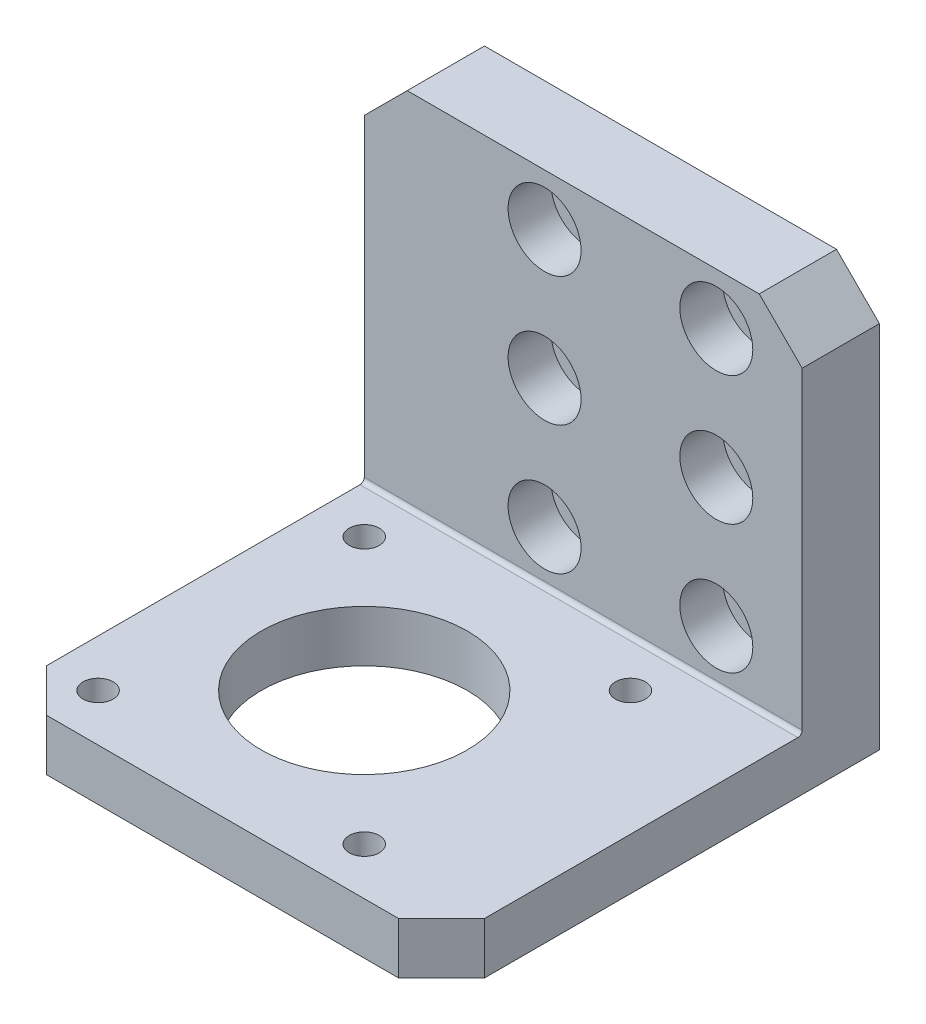
ISO-10303-21;
HEADER;
FILE_DESCRIPTION(('STEP AP214'),'2;1');
FILE_NAME('part.step','',(''),(''),'','','');
FILE_SCHEMA(('AUTOMOTIVE_DESIGN { 1 0 10303 214 1 1 1 1 }'));
ENDSEC;
DATA;
#1=APPLICATION_CONTEXT('core data for automotive mechanical design processes');
#2=APPLICATION_PROTOCOL_DEFINITION('international standard','automotive_design',2000,#1);
#3=PRODUCT_CONTEXT('',#1,'mechanical');
#4=PRODUCT('Part','Part','',(#3));
#5=PRODUCT_RELATED_PRODUCT_CATEGORY('part','',(#4));
#6=PRODUCT_DEFINITION_FORMATION('','',#4);
#7=PRODUCT_DEFINITION_CONTEXT('part definition',#1,'design');
#8=PRODUCT_DEFINITION('design','',#6,#7);
#9=PRODUCT_DEFINITION_SHAPE('','',#8);
#10=(LENGTH_UNIT() NAMED_UNIT(*) SI_UNIT(.MILLI.,.METRE.));
#11=(NAMED_UNIT(*) PLANE_ANGLE_UNIT() SI_UNIT($,.RADIAN.));
#12=(NAMED_UNIT(*) SI_UNIT($,.STERADIAN.) SOLID_ANGLE_UNIT());
#13=UNCERTAINTY_MEASURE_WITH_UNIT(LENGTH_MEASURE(1.E-05),#10,'distance_accuracy_value','');
#14=(GEOMETRIC_REPRESENTATION_CONTEXT(3) GLOBAL_UNCERTAINTY_ASSIGNED_CONTEXT((#13)) GLOBAL_UNIT_ASSIGNED_CONTEXT((#10,
#11,#12)) REPRESENTATION_CONTEXT('',''));
#15=CARTESIAN_POINT('',(0.,0.,0.));
#16=DIRECTION('',(0.,0.,1.));
#17=DIRECTION('',(1.,0.,0.));
#18=AXIS2_PLACEMENT_3D('',#15,#16,#17);
#19=CARTESIAN_POINT('',(20.,15.,9.));
#20=DIRECTION('',(0.,0.,-1.));
#21=DIRECTION('',(-1.,0.,0.));
#22=AXIS2_PLACEMENT_3D('',#19,#20,#21);
#23=CYLINDRICAL_SURFACE('',#22,2.75);
#24=CARTESIAN_POINT('',(20.,15.,0.));
#25=DIRECTION('',(0.,0.,1.));
#26=DIRECTION('',(1.,0.,0.));
#27=AXIS2_PLACEMENT_3D('',#24,#25,#26);
#28=CIRCLE('',#27,2.75);
#29=CARTESIAN_POINT('',(22.75,15.,0.));
#30=VERTEX_POINT('',#29);
#31=EDGE_CURVE('E261',#30,#30,#28,.T.);
#32=ORIENTED_EDGE('',*,*,#31,.F.);
#33=EDGE_LOOP('',(#32));
#34=FACE_BOUND('',#33,.T.);
#35=CARTESIAN_POINT('',(20.,15.,4.));
#36=DIRECTION('',(0.,0.,1.));
#37=DIRECTION('',(1.,0.,0.));
#38=AXIS2_PLACEMENT_3D('',#35,#36,#37);
#39=CIRCLE('',#38,2.75);
#40=CARTESIAN_POINT('',(22.75,15.,4.));
#41=VERTEX_POINT('',#40);
#42=EDGE_CURVE('E187',#41,#41,#39,.T.);
#43=ORIENTED_EDGE('',*,*,#42,.T.);
#44=EDGE_LOOP('',(#43));
#45=FACE_BOUND('',#44,.T.);
#46=ADVANCED_FACE('F33',(#34,#45),#23,.F.);
#47=CARTESIAN_POINT('',(20.0000000000002,0.,9.));
#48=DIRECTION('',(0.,0.,-1.));
#49=DIRECTION('',(-1.,0.,0.));
#50=AXIS2_PLACEMENT_3D('',#47,#48,#49);
#51=CYLINDRICAL_SURFACE('',#50,2.75);
#52=CARTESIAN_POINT('',(20.0000000000002,0.,0.));
#53=DIRECTION('',(0.,0.,1.));
#54=DIRECTION('',(1.,0.,0.));
#55=AXIS2_PLACEMENT_3D('',#52,#53,#54);
#56=CIRCLE('',#55,2.75);
#57=CARTESIAN_POINT('',(22.7500000000002,0.,0.));
#58=VERTEX_POINT('',#57);
#59=EDGE_CURVE('E258',#58,#58,#56,.T.);
#60=ORIENTED_EDGE('',*,*,#59,.F.);
#61=EDGE_LOOP('',(#60));
#62=FACE_BOUND('',#61,.T.);
#63=CARTESIAN_POINT('',(20.0000000000002,0.,4.));
#64=DIRECTION('',(0.,0.,1.));
#65=DIRECTION('',(1.,0.,0.));
#66=AXIS2_PLACEMENT_3D('',#63,#64,#65);
#67=CIRCLE('',#66,2.75);
#68=CARTESIAN_POINT('',(22.7500000000002,0.,4.));
#69=VERTEX_POINT('',#68);
#70=EDGE_CURVE('E289',#69,#69,#67,.T.);
#71=ORIENTED_EDGE('',*,*,#70,.T.);
#72=EDGE_LOOP('',(#71));
#73=FACE_BOUND('',#72,.T.);
#74=ADVANCED_FACE('F358',(#62,#73),#51,.F.);
#75=CARTESIAN_POINT('',(20.0000000000003,-15.,9.));
#76=DIRECTION('',(0.,0.,-1.));
#77=DIRECTION('',(-1.,0.,0.));
#78=AXIS2_PLACEMENT_3D('',#75,#76,#77);
#79=CYLINDRICAL_SURFACE('',#78,2.75);
#80=CARTESIAN_POINT('',(20.0000000000003,-15.,0.));
#81=DIRECTION('',(0.,0.,1.));
#82=DIRECTION('',(1.,0.,0.));
#83=AXIS2_PLACEMENT_3D('',#80,#81,#82);
#84=CIRCLE('',#83,2.75);
#85=CARTESIAN_POINT('',(22.7500000000003,-15.,0.));
#86=VERTEX_POINT('',#85);
#87=EDGE_CURVE('E255',#86,#86,#84,.T.);
#88=ORIENTED_EDGE('',*,*,#87,.F.);
#89=EDGE_LOOP('',(#88));
#90=FACE_BOUND('',#89,.T.);
#91=CARTESIAN_POINT('',(20.0000000000003,-15.,4.));
#92=DIRECTION('',(0.,0.,1.));
#93=DIRECTION('',(1.,0.,0.));
#94=AXIS2_PLACEMENT_3D('',#91,#92,#93);
#95=CIRCLE('',#94,2.75);
#96=CARTESIAN_POINT('',(22.7500000000003,-15.,4.));
#97=VERTEX_POINT('',#96);
#98=EDGE_CURVE('E286',#97,#97,#95,.T.);
#99=ORIENTED_EDGE('',*,*,#98,.T.);
#100=EDGE_LOOP('',(#99));
#101=FACE_BOUND('',#100,.T.);
#102=ADVANCED_FACE('F364',(#90,#101),#79,.F.);
#103=CARTESIAN_POINT('',(1.57116660247941E-13,0.,9.));
#104=DIRECTION('',(0.,0.,-1.));
#105=DIRECTION('',(-1.,0.,0.));
#106=AXIS2_PLACEMENT_3D('',#103,#104,#105);
#107=CYLINDRICAL_SURFACE('',#106,2.75);
#108=CARTESIAN_POINT('',(1.57116660247941E-13,0.,0.));
#109=DIRECTION('',(0.,0.,1.));
#110=DIRECTION('',(1.,0.,0.));
#111=AXIS2_PLACEMENT_3D('',#108,#109,#110);
#112=CIRCLE('',#111,2.75);
#113=CARTESIAN_POINT('',(2.75000000000016,0.,0.));
#114=VERTEX_POINT('',#113);
#115=EDGE_CURVE('E252',#114,#114,#112,.T.);
#116=ORIENTED_EDGE('',*,*,#115,.F.);
#117=EDGE_LOOP('',(#116));
#118=FACE_BOUND('',#117,.T.);
#119=CARTESIAN_POINT('',(1.57116660247941E-13,0.,4.));
#120=DIRECTION('',(0.,0.,1.));
#121=DIRECTION('',(1.,0.,0.));
#122=AXIS2_PLACEMENT_3D('',#119,#120,#121);
#123=CIRCLE('',#122,2.75);
#124=CARTESIAN_POINT('',(2.75000000000016,0.,4.));
#125=VERTEX_POINT('',#124);
#126=EDGE_CURVE('E283',#125,#125,#123,.T.);
#127=ORIENTED_EDGE('',*,*,#126,.T.);
#128=EDGE_LOOP('',(#127));
#129=FACE_BOUND('',#128,.T.);
#130=ADVANCED_FACE('F426',(#118,#129),#107,.F.);
#131=CARTESIAN_POINT('',(3.14233320495882E-13,-15.,9.));
#132=DIRECTION('',(0.,0.,-1.));
#133=DIRECTION('',(-1.,0.,0.));
#134=AXIS2_PLACEMENT_3D('',#131,#132,#133);
#135=CYLINDRICAL_SURFACE('',#134,2.75);
#136=CARTESIAN_POINT('',(3.14233320495882E-13,-15.,0.));
#137=DIRECTION('',(0.,0.,1.));
#138=DIRECTION('',(1.,0.,0.));
#139=AXIS2_PLACEMENT_3D('',#136,#137,#138);
#140=CIRCLE('',#139,2.75);
#141=CARTESIAN_POINT('',(2.75000000000031,-15.,0.));
#142=VERTEX_POINT('',#141);
#143=EDGE_CURVE('E249',#142,#142,#140,.T.);
#144=ORIENTED_EDGE('',*,*,#143,.F.);
#145=EDGE_LOOP('',(#144));
#146=FACE_BOUND('',#145,.T.);
#147=CARTESIAN_POINT('',(3.14233320495882E-13,-15.,4.));
#148=DIRECTION('',(0.,0.,1.));
#149=DIRECTION('',(1.,0.,0.));
#150=AXIS2_PLACEMENT_3D('',#147,#148,#149);
#151=CIRCLE('',#150,2.75);
#152=CARTESIAN_POINT('',(2.75000000000031,-15.,4.));
#153=VERTEX_POINT('',#152);
#154=EDGE_CURVE('E171',#153,#153,#151,.T.);
#155=ORIENTED_EDGE('',*,*,#154,.T.);
#156=EDGE_LOOP('',(#155));
#157=FACE_BOUND('',#156,.T.);
#158=ADVANCED_FACE('F374',(#146,#157),#135,.F.);
#159=CARTESIAN_POINT('',(0.,15.,9.));
#160=DIRECTION('',(0.,0.,-1.));
#161=DIRECTION('',(-1.,0.,0.));
#162=AXIS2_PLACEMENT_3D('',#159,#160,#161);
#163=CYLINDRICAL_SURFACE('',#162,2.75);
#164=CARTESIAN_POINT('',(0.,15.,0.));
#165=DIRECTION('',(0.,0.,1.));
#166=DIRECTION('',(1.,0.,0.));
#167=AXIS2_PLACEMENT_3D('',#164,#165,#166);
#168=CIRCLE('',#167,2.75);
#169=CARTESIAN_POINT('',(2.75,15.,0.));
#170=VERTEX_POINT('',#169);
#171=EDGE_CURVE('E264',#170,#170,#168,.T.);
#172=ORIENTED_EDGE('',*,*,#171,.F.);
#173=EDGE_LOOP('',(#172));
#174=FACE_BOUND('',#173,.T.);
#175=CARTESIAN_POINT('',(0.,15.,4.));
#176=DIRECTION('',(0.,0.,1.));
#177=DIRECTION('',(1.,0.,0.));
#178=AXIS2_PLACEMENT_3D('',#175,#176,#177);
#179=CIRCLE('',#178,2.75);
#180=CARTESIAN_POINT('',(2.75,15.,4.));
#181=VERTEX_POINT('',#180);
#182=EDGE_CURVE('E183',#181,#181,#179,.T.);
#183=ORIENTED_EDGE('',*,*,#182,.T.);
#184=EDGE_LOOP('',(#183));
#185=FACE_BOUND('',#184,.T.);
#186=ADVANCED_FACE('F371',(#174,#185),#163,.F.);
#187=CARTESIAN_POINT('',(0.,0.,9.));
#188=DIRECTION('',(0.,0.,1.));
#189=DIRECTION('',(1.,0.,0.));
#190=AXIS2_PLACEMENT_3D('',#187,#188,#189);
#191=PLANE('',#190);
#192=CARTESIAN_POINT('',(3.13984949151802E-13,-15.,9.));
#193=DIRECTION('',(0.,0.,1.));
#194=DIRECTION('',(1.,0.,0.));
#195=AXIS2_PLACEMENT_3D('',#192,#193,#194);
#196=CIRCLE('',#195,4.25);
#197=CARTESIAN_POINT('',(4.25000000000031,-15.,9.));
#198=VERTEX_POINT('',#197);
#199=EDGE_CURVE('E145',#198,#198,#196,.T.);
#200=ORIENTED_EDGE('',*,*,#199,.F.);
#201=EDGE_LOOP('',(#200));
#202=FACE_BOUND('',#201,.T.);
#203=CARTESIAN_POINT('',(1.57859836313889E-13,0.,9.));
#204=DIRECTION('',(0.,0.,1.));
#205=DIRECTION('',(1.,0.,0.));
#206=AXIS2_PLACEMENT_3D('',#203,#204,#205);
#207=CIRCLE('',#206,4.25);
#208=CARTESIAN_POINT('',(4.25000000000016,0.,9.));
#209=VERTEX_POINT('',#208);
#210=EDGE_CURVE('E163',#209,#209,#207,.T.);
#211=ORIENTED_EDGE('',*,*,#210,.F.);
#212=EDGE_LOOP('',(#211));
#213=FACE_BOUND('',#212,.T.);
#214=CARTESIAN_POINT('',(20.0000000000003,-15.,9.));
#215=DIRECTION('',(0.,0.,1.));
#216=DIRECTION('',(1.,0.,0.));
#217=AXIS2_PLACEMENT_3D('',#214,#215,#216);
#218=CIRCLE('',#217,4.25);
#219=CARTESIAN_POINT('',(24.2500000000003,-15.,9.));
#220=VERTEX_POINT('',#219);
#221=EDGE_CURVE('E157',#220,#220,#218,.T.);
#222=ORIENTED_EDGE('',*,*,#221,.F.);
#223=EDGE_LOOP('',(#222));
#224=FACE_BOUND('',#223,.T.);
#225=CARTESIAN_POINT('',(20.0000000000002,0.,9.));
#226=DIRECTION('',(0.,0.,1.));
#227=DIRECTION('',(1.,0.,0.));
#228=AXIS2_PLACEMENT_3D('',#225,#226,#227);
#229=CIRCLE('',#228,4.25);
#230=CARTESIAN_POINT('',(24.2500000000002,0.,9.));
#231=VERTEX_POINT('',#230);
#232=EDGE_CURVE('E156',#231,#231,#229,.T.);
#233=ORIENTED_EDGE('',*,*,#232,.F.);
#234=EDGE_LOOP('',(#233));
#235=FACE_BOUND('',#234,.T.);
#236=CARTESIAN_POINT('',(20.,15.,9.));
#237=DIRECTION('',(0.,0.,1.));
#238=DIRECTION('',(1.,0.,0.));
#239=AXIS2_PLACEMENT_3D('',#236,#237,#238);
#240=CIRCLE('',#239,4.25);
#241=CARTESIAN_POINT('',(24.25,15.,9.));
#242=VERTEX_POINT('',#241);
#243=EDGE_CURVE('E172',#242,#242,#240,.T.);
#244=ORIENTED_EDGE('',*,*,#243,.F.);
#245=EDGE_LOOP('',(#244));
#246=FACE_BOUND('',#245,.T.);
#247=CARTESIAN_POINT('',(0.,15.,9.));
#248=DIRECTION('',(0.,0.,1.));
#249=DIRECTION('',(1.,0.,0.));
#250=AXIS2_PLACEMENT_3D('',#247,#248,#249);
#251=CIRCLE('',#250,4.25);
#252=CARTESIAN_POINT('',(4.25,15.,9.));
#253=VERTEX_POINT('',#252);
#254=EDGE_CURVE('E184',#253,#253,#251,.T.);
#255=ORIENTED_EDGE('',*,*,#254,.F.);
#256=EDGE_LOOP('',(#255));
#257=FACE_BOUND('',#256,.T.);
#258=DIRECTION('',(0.,-1.,0.));
#259=VECTOR('',#258,1.);
#260=CARTESIAN_POINT('',(-21.,21.,9.));
#261=LINE('',#260,#259);
#262=CARTESIAN_POINT('',(-21.,16.,9.));
#263=VERTEX_POINT('',#262);
#264=CARTESIAN_POINT('',(-21.,-20.5,9.));
#265=VERTEX_POINT('',#264);
#266=EDGE_CURVE('E267',#263,#265,#261,.T.);
#267=ORIENTED_EDGE('',*,*,#266,.T.);
#268=DIRECTION('',(1.,0.,0.));
#269=VECTOR('',#268,1.);
#270=CARTESIAN_POINT('',(30.,-20.5,9.));
#271=LINE('',#270,#269);
#272=CARTESIAN_POINT('',(30.,-20.5,9.));
#273=VERTEX_POINT('',#272);
#274=EDGE_CURVE('E327',#265,#273,#271,.T.);
#275=ORIENTED_EDGE('',*,*,#274,.T.);
#276=DIRECTION('',(0.,1.,0.));
#277=VECTOR('',#276,1.);
#278=CARTESIAN_POINT('',(30.,21.,9.));
#279=LINE('',#278,#277);
#280=CARTESIAN_POINT('',(30.,16.,9.));
#281=VERTEX_POINT('',#280);
#282=EDGE_CURVE('E270',#273,#281,#279,.T.);
#283=ORIENTED_EDGE('',*,*,#282,.T.);
#284=DIRECTION('',(0.707106781186547,-0.707106781186548,0.));
#285=VECTOR('',#284,1.);
#286=CARTESIAN_POINT('',(23.,23.,9.));
#287=LINE('',#286,#285);
#288=CARTESIAN_POINT('',(25.,21.,9.));
#289=VERTEX_POINT('',#288);
#290=EDGE_CURVE('E304',#281,#289,#287,.F.);
#291=ORIENTED_EDGE('',*,*,#290,.T.);
#292=DIRECTION('',(-1.,0.,0.));
#293=VECTOR('',#292,1.);
#294=CARTESIAN_POINT('',(30.,21.,9.));
#295=LINE('',#294,#293);
#296=CARTESIAN_POINT('',(-16.,21.,9.));
#297=VERTEX_POINT('',#296);
#298=EDGE_CURVE('E272',#289,#297,#295,.T.);
#299=ORIENTED_EDGE('',*,*,#298,.T.);
#300=DIRECTION('',(0.707106781186548,0.707106781186547,0.));
#301=VECTOR('',#300,1.);
#302=CARTESIAN_POINT('',(-18.5,18.5,9.));
#303=LINE('',#302,#301);
#304=EDGE_CURVE('E306',#297,#263,#303,.F.);
#305=ORIENTED_EDGE('',*,*,#304,.T.);
#306=EDGE_LOOP('',(#267,#275,#283,#291,#299,#305));
#307=FACE_BOUND('',#306,.T.);
#308=ADVANCED_FACE('F332',(#202,#213,#224,#235,#246,#257,#307),#191,.T.);
#309=CARTESIAN_POINT('',(0.,0.,0.));
#310=DIRECTION('',(0.,0.,1.));
#311=DIRECTION('',(1.,0.,0.));
#312=AXIS2_PLACEMENT_3D('',#309,#310,#311);
#313=PLANE('',#312);
#314=DIRECTION('',(0.,1.,0.));
#315=VECTOR('',#314,1.);
#316=CARTESIAN_POINT('',(30.,21.,0.));
#317=LINE('',#316,#315);
#318=CARTESIAN_POINT('',(30.,-27.,0.));
#319=VERTEX_POINT('',#318);
#320=CARTESIAN_POINT('',(30.,16.,0.));
#321=VERTEX_POINT('',#320);
#322=EDGE_CURVE('E116',#319,#321,#317,.T.);
#323=ORIENTED_EDGE('',*,*,#322,.F.);
#324=DIRECTION('',(-1.,0.,0.));
#325=VECTOR('',#324,1.);
#326=CARTESIAN_POINT('',(-21.,-27.,0.));
#327=LINE('',#326,#325);
#328=CARTESIAN_POINT('',(-21.,-27.,0.));
#329=VERTEX_POINT('',#328);
#330=EDGE_CURVE('E121',#319,#329,#327,.T.);
#331=ORIENTED_EDGE('',*,*,#330,.T.);
#332=DIRECTION('',(0.,-1.,0.));
#333=VECTOR('',#332,1.);
#334=CARTESIAN_POINT('',(-21.,21.,0.));
#335=LINE('',#334,#333);
#336=CARTESIAN_POINT('',(-21.,16.,0.));
#337=VERTEX_POINT('',#336);
#338=EDGE_CURVE('E128',#337,#329,#335,.T.);
#339=ORIENTED_EDGE('',*,*,#338,.F.);
#340=DIRECTION('',(-0.707106781186548,-0.707106781186547,0.));
#341=VECTOR('',#340,1.);
#342=CARTESIAN_POINT('',(-21.,16.,0.));
#343=LINE('',#342,#341);
#344=CARTESIAN_POINT('',(-16.,21.,0.));
#345=VERTEX_POINT('',#344);
#346=EDGE_CURVE('E297',#337,#345,#343,.F.);
#347=ORIENTED_EDGE('',*,*,#346,.T.);
#348=DIRECTION('',(-1.,0.,0.));
#349=VECTOR('',#348,1.);
#350=CARTESIAN_POINT('',(-21.,21.,0.));
#351=LINE('',#350,#349);
#352=CARTESIAN_POINT('',(25.,21.,0.));
#353=VERTEX_POINT('',#352);
#354=EDGE_CURVE('E127',#353,#345,#351,.T.);
#355=ORIENTED_EDGE('',*,*,#354,.F.);
#356=DIRECTION('',(-0.707106781186547,0.707106781186548,0.));
#357=VECTOR('',#356,1.);
#358=CARTESIAN_POINT('',(25.,21.,0.));
#359=LINE('',#358,#357);
#360=EDGE_CURVE('E123',#353,#321,#359,.F.);
#361=ORIENTED_EDGE('',*,*,#360,.T.);
#362=EDGE_LOOP('',(#323,#331,#339,#347,#355,#361));
#363=FACE_BOUND('',#362,.T.);
#364=ORIENTED_EDGE('',*,*,#171,.T.);
#365=EDGE_LOOP('',(#364));
#366=FACE_BOUND('',#365,.T.);
#367=ORIENTED_EDGE('',*,*,#31,.T.);
#368=EDGE_LOOP('',(#367));
#369=FACE_BOUND('',#368,.T.);
#370=ORIENTED_EDGE('',*,*,#59,.T.);
#371=EDGE_LOOP('',(#370));
#372=FACE_BOUND('',#371,.T.);
#373=ORIENTED_EDGE('',*,*,#87,.T.);
#374=EDGE_LOOP('',(#373));
#375=FACE_BOUND('',#374,.T.);
#376=ORIENTED_EDGE('',*,*,#115,.T.);
#377=EDGE_LOOP('',(#376));
#378=FACE_BOUND('',#377,.T.);
#379=ORIENTED_EDGE('',*,*,#143,.T.);
#380=EDGE_LOOP('',(#379));
#381=FACE_BOUND('',#380,.T.);
#382=ADVANCED_FACE('F118',(#363,#366,#369,#372,#375,#378,#381),#313,.F.);
#383=CARTESIAN_POINT('',(-21.,21.,9.));
#384=DIRECTION('',(1.,0.,0.));
#385=DIRECTION('',(0.,0.,-1.));
#386=AXIS2_PLACEMENT_3D('',#383,#384,#385);
#387=PLANE('',#386);
#388=DIRECTION('',(0.,0.,1.));
#389=VECTOR('',#388,1.);
#390=CARTESIAN_POINT('',(-21.,-27.,9.));
#391=LINE('',#390,#389);
#392=CARTESIAN_POINT('',(-21.,-27.,46.));
#393=VERTEX_POINT('',#392);
#394=EDGE_CURVE('E139',#329,#393,#391,.T.);
#395=ORIENTED_EDGE('',*,*,#394,.T.);
#396=DIRECTION('',(0.,1.,0.));
#397=VECTOR('',#396,1.);
#398=CARTESIAN_POINT('',(-21.,21.,46.));
#399=LINE('',#398,#397);
#400=CARTESIAN_POINT('',(-21.,-21.,46.));
#401=VERTEX_POINT('',#400);
#402=EDGE_CURVE('E310',#393,#401,#399,.T.);
#403=ORIENTED_EDGE('',*,*,#402,.T.);
#404=DIRECTION('',(0.,0.,-1.));
#405=VECTOR('',#404,1.);
#406=CARTESIAN_POINT('',(-21.,-21.,9.));
#407=LINE('',#406,#405);
#408=CARTESIAN_POINT('',(-21.,-21.,9.5));
#409=VERTEX_POINT('',#408);
#410=EDGE_CURVE('E233',#401,#409,#407,.T.);
#411=ORIENTED_EDGE('',*,*,#410,.T.);
#412=CARTESIAN_POINT('',(-21.,-20.5,9.5));
#413=DIRECTION('',(1.,0.,0.));
#414=DIRECTION('',(0.,0.,-1.));
#415=AXIS2_PLACEMENT_3D('',#412,#413,#414);
#416=CIRCLE('',#415,0.5);
#417=EDGE_CURVE('E11',#409,#265,#416,.T.);
#418=ORIENTED_EDGE('',*,*,#417,.T.);
#419=ORIENTED_EDGE('',*,*,#266,.F.);
#420=DIRECTION('',(0.,0.,-1.));
#421=VECTOR('',#420,1.);
#422=CARTESIAN_POINT('',(-21.,16.,9.));
#423=LINE('',#422,#421);
#424=EDGE_CURVE('E275',#263,#337,#423,.T.);
#425=ORIENTED_EDGE('',*,*,#424,.T.);
#426=ORIENTED_EDGE('',*,*,#338,.T.);
#427=EDGE_LOOP('',(#395,#403,#411,#418,#419,#425,#426));
#428=FACE_BOUND('',#427,.T.);
#429=ADVANCED_FACE('F349',(#428),#387,.F.);
#430=CARTESIAN_POINT('',(30.,21.,9.));
#431=DIRECTION('',(-1.,0.,0.));
#432=DIRECTION('',(0.,-1.,0.));
#433=AXIS2_PLACEMENT_3D('',#430,#431,#432);
#434=PLANE('',#433);
#435=DIRECTION('',(0.,0.,-1.));
#436=VECTOR('',#435,1.);
#437=CARTESIAN_POINT('',(30.,-21.,51.));
#438=LINE('',#437,#436);
#439=CARTESIAN_POINT('',(30.,-21.,46.));
#440=VERTEX_POINT('',#439);
#441=CARTESIAN_POINT('',(30.,-21.,9.5));
#442=VERTEX_POINT('',#441);
#443=EDGE_CURVE('E146',#440,#442,#438,.T.);
#444=ORIENTED_EDGE('',*,*,#443,.F.);
#445=DIRECTION('',(0.,-1.,0.));
#446=VECTOR('',#445,1.);
#447=CARTESIAN_POINT('',(30.,21.,46.));
#448=LINE('',#447,#446);
#449=CARTESIAN_POINT('',(30.,-27.,46.));
#450=VERTEX_POINT('',#449);
#451=EDGE_CURVE('E144',#440,#450,#448,.T.);
#452=ORIENTED_EDGE('',*,*,#451,.T.);
#453=DIRECTION('',(0.,0.,1.));
#454=VECTOR('',#453,1.);
#455=CARTESIAN_POINT('',(30.,-27.,51.));
#456=LINE('',#455,#454);
#457=EDGE_CURVE('E136',#319,#450,#456,.T.);
#458=ORIENTED_EDGE('',*,*,#457,.F.);
#459=ORIENTED_EDGE('',*,*,#322,.T.);
#460=DIRECTION('',(0.,0.,1.));
#461=VECTOR('',#460,1.);
#462=CARTESIAN_POINT('',(30.,16.,9.));
#463=LINE('',#462,#461);
#464=EDGE_CURVE('E308',#321,#281,#463,.T.);
#465=ORIENTED_EDGE('',*,*,#464,.T.);
#466=ORIENTED_EDGE('',*,*,#282,.F.);
#467=CARTESIAN_POINT('',(30.,-20.5,9.5));
#468=DIRECTION('',(-1.,0.,0.));
#469=DIRECTION('',(0.,-1.,0.));
#470=AXIS2_PLACEMENT_3D('',#467,#468,#469);
#471=CIRCLE('',#470,0.5);
#472=EDGE_CURVE('E41',#273,#442,#471,.T.);
#473=ORIENTED_EDGE('',*,*,#472,.T.);
#474=EDGE_LOOP('',(#444,#452,#458,#459,#465,#466,#473));
#475=FACE_BOUND('',#474,.T.);
#476=ADVANCED_FACE('F142',(#475),#434,.F.);
#477=CARTESIAN_POINT('',(-21.,21.,9.));
#478=DIRECTION('',(0.,-1.,0.));
#479=DIRECTION('',(0.,0.,-1.));
#480=AXIS2_PLACEMENT_3D('',#477,#478,#479);
#481=PLANE('',#480);
#482=ORIENTED_EDGE('',*,*,#354,.T.);
#483=DIRECTION('',(0.,0.,1.));
#484=VECTOR('',#483,1.);
#485=CARTESIAN_POINT('',(-16.,21.,9.));
#486=LINE('',#485,#484);
#487=EDGE_CURVE('E302',#345,#297,#486,.T.);
#488=ORIENTED_EDGE('',*,*,#487,.T.);
#489=ORIENTED_EDGE('',*,*,#298,.F.);
#490=DIRECTION('',(0.,0.,-1.));
#491=VECTOR('',#490,1.);
#492=CARTESIAN_POINT('',(25.,21.,9.));
#493=LINE('',#492,#491);
#494=EDGE_CURVE('E299',#289,#353,#493,.T.);
#495=ORIENTED_EDGE('',*,*,#494,.T.);
#496=EDGE_LOOP('',(#482,#488,#489,#495));
#497=FACE_BOUND('',#496,.T.);
#498=ADVANCED_FACE('F343',(#497),#481,.F.);
#499=CARTESIAN_POINT('',(0.,-27.,0.));
#500=DIRECTION('',(0.,1.,0.));
#501=DIRECTION('',(0.,0.,1.));
#502=AXIS2_PLACEMENT_3D('',#499,#500,#501);
#503=PLANE('',#502);
#504=DIRECTION('',(-1.,0.,0.));
#505=VECTOR('',#504,1.);
#506=CARTESIAN_POINT('',(-21.,-27.,51.));
#507=LINE('',#506,#505);
#508=CARTESIAN_POINT('',(25.,-27.,51.));
#509=VERTEX_POINT('',#508);
#510=CARTESIAN_POINT('',(-16.,-27.,51.));
#511=VERTEX_POINT('',#510);
#512=EDGE_CURVE('E140',#509,#511,#507,.T.);
#513=ORIENTED_EDGE('',*,*,#512,.T.);
#514=DIRECTION('',(0.707106781186549,0.,0.707106781186546));
#515=VECTOR('',#514,1.);
#516=CARTESIAN_POINT('',(-21.,-27.,46.));
#517=LINE('',#516,#515);
#518=EDGE_CURVE('E324',#511,#393,#517,.F.);
#519=ORIENTED_EDGE('',*,*,#518,.T.);
#520=ORIENTED_EDGE('',*,*,#394,.F.);
#521=ORIENTED_EDGE('',*,*,#330,.F.);
#522=ORIENTED_EDGE('',*,*,#457,.T.);
#523=DIRECTION('',(0.707106781186547,0.,-0.707106781186548));
#524=VECTOR('',#523,1.);
#525=CARTESIAN_POINT('',(25.,-27.,51.));
#526=LINE('',#525,#524);
#527=EDGE_CURVE('E322',#450,#509,#526,.F.);
#528=ORIENTED_EDGE('',*,*,#527,.T.);
#529=EDGE_LOOP('',(#513,#519,#520,#521,#522,#528));
#530=FACE_BOUND('',#529,.T.);
#531=CARTESIAN_POINT('',(-15.5,-27.,14.5));
#532=DIRECTION('',(0.,-1.,0.));
#533=DIRECTION('',(0.,0.,1.));
#534=AXIS2_PLACEMENT_3D('',#531,#532,#533);
#535=CIRCLE('',#534,3.);
#536=CARTESIAN_POINT('',(-15.5,-27.,17.5));
#537=VERTEX_POINT('',#536);
#538=EDGE_CURVE('E192',#537,#537,#535,.T.);
#539=ORIENTED_EDGE('',*,*,#538,.F.);
#540=EDGE_LOOP('',(#539));
#541=FACE_BOUND('',#540,.T.);
#542=CARTESIAN_POINT('',(15.5,-27.,14.5));
#543=DIRECTION('',(0.,-1.,0.));
#544=DIRECTION('',(0.,0.,-1.));
#545=AXIS2_PLACEMENT_3D('',#542,#543,#544);
#546=CIRCLE('',#545,3.);
#547=CARTESIAN_POINT('',(15.5,-27.,11.5));
#548=VERTEX_POINT('',#547);
#549=EDGE_CURVE('E198',#548,#548,#546,.T.);
#550=ORIENTED_EDGE('',*,*,#549,.F.);
#551=EDGE_LOOP('',(#550));
#552=FACE_BOUND('',#551,.T.);
#553=CARTESIAN_POINT('',(15.5,-27.,45.5));
#554=DIRECTION('',(0.,-1.,0.));
#555=DIRECTION('',(0.,0.,1.));
#556=AXIS2_PLACEMENT_3D('',#553,#554,#555);
#557=CIRCLE('',#556,3.);
#558=CARTESIAN_POINT('',(15.5,-27.,48.5));
#559=VERTEX_POINT('',#558);
#560=EDGE_CURVE('E204',#559,#559,#557,.T.);
#561=ORIENTED_EDGE('',*,*,#560,.F.);
#562=EDGE_LOOP('',(#561));
#563=FACE_BOUND('',#562,.T.);
#564=CARTESIAN_POINT('',(-15.5,-27.,45.5));
#565=DIRECTION('',(0.,-1.,0.));
#566=DIRECTION('',(0.,0.,-1.));
#567=AXIS2_PLACEMENT_3D('',#564,#565,#566);
#568=CIRCLE('',#567,3.);
#569=CARTESIAN_POINT('',(-15.5,-27.,42.5));
#570=VERTEX_POINT('',#569);
#571=EDGE_CURVE('E211',#570,#570,#568,.T.);
#572=ORIENTED_EDGE('',*,*,#571,.F.);
#573=EDGE_LOOP('',(#572));
#574=FACE_BOUND('',#573,.T.);
#575=CARTESIAN_POINT('',(0.,-27.,30.));
#576=DIRECTION('',(0.,-1.,0.));
#577=DIRECTION('',(0.,0.,-1.));
#578=AXIS2_PLACEMENT_3D('',#575,#576,#577);
#579=CIRCLE('',#578,12.);
#580=CARTESIAN_POINT('',(0.,-27.,18.));
#581=VERTEX_POINT('',#580);
#582=EDGE_CURVE('E215',#581,#581,#579,.T.);
#583=ORIENTED_EDGE('',*,*,#582,.F.);
#584=EDGE_LOOP('',(#583));
#585=FACE_BOUND('',#584,.T.);
#586=ADVANCED_FACE('F134',(#530,#541,#552,#563,#574,#585),#503,.F.);
#587=CARTESIAN_POINT('',(15.5,-27.,14.5));
#588=DIRECTION('',(0.,1.,0.));
#589=DIRECTION('',(0.,0.,1.));
#590=AXIS2_PLACEMENT_3D('',#587,#588,#589);
#591=CYLINDRICAL_SURFACE('',#590,1.75);
#592=CARTESIAN_POINT('',(15.5,-21.,14.5));
#593=DIRECTION('',(0.,-1.,0.));
#594=DIRECTION('',(0.,0.,-1.));
#595=AXIS2_PLACEMENT_3D('',#592,#593,#594);
#596=CIRCLE('',#595,1.75);
#597=CARTESIAN_POINT('',(15.5,-21.,12.75));
#598=VERTEX_POINT('',#597);
#599=EDGE_CURVE('E224',#598,#598,#596,.T.);
#600=ORIENTED_EDGE('',*,*,#599,.F.);
#601=EDGE_LOOP('',(#600));
#602=FACE_BOUND('',#601,.T.);
#603=CARTESIAN_POINT('',(15.5,-24.,14.5));
#604=DIRECTION('',(0.,-1.,0.));
#605=DIRECTION('',(0.,0.,-1.));
#606=AXIS2_PLACEMENT_3D('',#603,#604,#605);
#607=CIRCLE('',#606,1.75);
#608=CARTESIAN_POINT('',(15.5,-24.,12.75));
#609=VERTEX_POINT('',#608);
#610=EDGE_CURVE('E243',#609,#609,#607,.T.);
#611=ORIENTED_EDGE('',*,*,#610,.T.);
#612=EDGE_LOOP('',(#611));
#613=FACE_BOUND('',#612,.T.);
#614=ADVANCED_FACE('F423',(#602,#613),#591,.F.);
#615=CARTESIAN_POINT('',(-15.5,-27.,45.5));
#616=DIRECTION('',(0.,1.,0.));
#617=DIRECTION('',(0.,0.,1.));
#618=AXIS2_PLACEMENT_3D('',#615,#616,#617);
#619=CYLINDRICAL_SURFACE('',#618,1.75);
#620=CARTESIAN_POINT('',(-15.5,-21.,45.5));
#621=DIRECTION('',(0.,-1.,0.));
#622=DIRECTION('',(0.,0.,-1.));
#623=AXIS2_PLACEMENT_3D('',#620,#621,#622);
#624=CIRCLE('',#623,1.75);
#625=CARTESIAN_POINT('',(-15.5,-21.,43.75));
#626=VERTEX_POINT('',#625);
#627=EDGE_CURVE('E230',#626,#626,#624,.T.);
#628=ORIENTED_EDGE('',*,*,#627,.F.);
#629=EDGE_LOOP('',(#628));
#630=FACE_BOUND('',#629,.T.);
#631=CARTESIAN_POINT('',(-15.5,-24.,45.5));
#632=DIRECTION('',(0.,-1.,0.));
#633=DIRECTION('',(0.,0.,-1.));
#634=AXIS2_PLACEMENT_3D('',#631,#632,#633);
#635=CIRCLE('',#634,1.75);
#636=CARTESIAN_POINT('',(-15.5,-24.,43.75));
#637=VERTEX_POINT('',#636);
#638=EDGE_CURVE('E210',#637,#637,#635,.T.);
#639=ORIENTED_EDGE('',*,*,#638,.T.);
#640=EDGE_LOOP('',(#639));
#641=FACE_BOUND('',#640,.T.);
#642=ADVANCED_FACE('F416',(#630,#641),#619,.F.);
#643=CARTESIAN_POINT('',(0.,-21.,0.));
#644=DIRECTION('',(0.,1.,0.));
#645=DIRECTION('',(0.,0.,1.));
#646=AXIS2_PLACEMENT_3D('',#643,#644,#645);
#647=PLANE('',#646);
#648=CARTESIAN_POINT('',(15.5,-21.,45.5));
#649=DIRECTION('',(0.,-1.,0.));
#650=DIRECTION('',(0.,0.,1.));
#651=AXIS2_PLACEMENT_3D('',#648,#649,#650);
#652=CIRCLE('',#651,1.75);
#653=CARTESIAN_POINT('',(15.5,-21.,47.25));
#654=VERTEX_POINT('',#653);
#655=EDGE_CURVE('E218',#654,#654,#652,.T.);
#656=ORIENTED_EDGE('',*,*,#655,.T.);
#657=EDGE_LOOP('',(#656));
#658=FACE_BOUND('',#657,.T.);
#659=CARTESIAN_POINT('',(-15.5,-21.,14.5));
#660=DIRECTION('',(0.,-1.,0.));
#661=DIRECTION('',(0.,0.,1.));
#662=AXIS2_PLACEMENT_3D('',#659,#660,#661);
#663=CIRCLE('',#662,1.75);
#664=CARTESIAN_POINT('',(-15.5,-21.,16.25));
#665=VERTEX_POINT('',#664);
#666=EDGE_CURVE('E227',#665,#665,#663,.T.);
#667=ORIENTED_EDGE('',*,*,#666,.T.);
#668=EDGE_LOOP('',(#667));
#669=FACE_BOUND('',#668,.T.);
#670=ORIENTED_EDGE('',*,*,#443,.T.);
#671=DIRECTION('',(1.,0.,0.));
#672=VECTOR('',#671,1.);
#673=CARTESIAN_POINT('',(-21.,-21.,9.5));
#674=LINE('',#673,#672);
#675=EDGE_CURVE('E54',#442,#409,#674,.F.);
#676=ORIENTED_EDGE('',*,*,#675,.T.);
#677=ORIENTED_EDGE('',*,*,#410,.F.);
#678=DIRECTION('',(-0.707106781186549,0.,-0.707106781186546));
#679=VECTOR('',#678,1.);
#680=CARTESIAN_POINT('',(-33.5,-21.,33.5000000000001));
#681=LINE('',#680,#679);
#682=CARTESIAN_POINT('',(-16.,-21.,51.));
#683=VERTEX_POINT('',#682);
#684=EDGE_CURVE('E315',#401,#683,#681,.F.);
#685=ORIENTED_EDGE('',*,*,#684,.T.);
#686=DIRECTION('',(-1.,0.,0.));
#687=VECTOR('',#686,1.);
#688=CARTESIAN_POINT('',(-21.,-21.,51.));
#689=LINE('',#688,#687);
#690=CARTESIAN_POINT('',(25.,-21.,51.));
#691=VERTEX_POINT('',#690);
#692=EDGE_CURVE('E235',#691,#683,#689,.T.);
#693=ORIENTED_EDGE('',*,*,#692,.F.);
#694=DIRECTION('',(-0.707106781186547,0.,0.707106781186548));
#695=VECTOR('',#694,1.);
#696=CARTESIAN_POINT('',(38.,-21.,37.9999999999999));
#697=LINE('',#696,#695);
#698=EDGE_CURVE('E313',#691,#440,#697,.F.);
#699=ORIENTED_EDGE('',*,*,#698,.T.);
#700=EDGE_LOOP('',(#670,#676,#677,#685,#693,#699));
#701=FACE_BOUND('',#700,.T.);
#702=ORIENTED_EDGE('',*,*,#627,.T.);
#703=EDGE_LOOP('',(#702));
#704=FACE_BOUND('',#703,.T.);
#705=ORIENTED_EDGE('',*,*,#599,.T.);
#706=EDGE_LOOP('',(#705));
#707=FACE_BOUND('',#706,.T.);
#708=CARTESIAN_POINT('',(0.,-21.,30.));
#709=DIRECTION('',(0.,-1.,0.));
#710=DIRECTION('',(0.,0.,-1.));
#711=AXIS2_PLACEMENT_3D('',#708,#709,#710);
#712=CIRCLE('',#711,12.);
#713=CARTESIAN_POINT('',(0.,-21.,18.));
#714=VERTEX_POINT('',#713);
#715=EDGE_CURVE('E219',#714,#714,#712,.T.);
#716=ORIENTED_EDGE('',*,*,#715,.T.);
#717=EDGE_LOOP('',(#716));
#718=FACE_BOUND('',#717,.T.);
#719=ADVANCED_FACE('F400',(#658,#669,#701,#704,#707,#718),#647,.T.);
#720=CARTESIAN_POINT('',(-21.,-27.,51.));
#721=DIRECTION('',(0.,0.,-1.));
#722=DIRECTION('',(-1.,0.,0.));
#723=AXIS2_PLACEMENT_3D('',#720,#721,#722);
#724=PLANE('',#723);
#725=ORIENTED_EDGE('',*,*,#692,.T.);
#726=DIRECTION('',(0.,-1.,0.));
#727=VECTOR('',#726,1.);
#728=CARTESIAN_POINT('',(-16.,-27.,51.));
#729=LINE('',#728,#727);
#730=EDGE_CURVE('E320',#683,#511,#729,.T.);
#731=ORIENTED_EDGE('',*,*,#730,.T.);
#732=ORIENTED_EDGE('',*,*,#512,.F.);
#733=DIRECTION('',(0.,1.,0.));
#734=VECTOR('',#733,1.);
#735=CARTESIAN_POINT('',(25.,-27.,51.));
#736=LINE('',#735,#734);
#737=EDGE_CURVE('E317',#509,#691,#736,.T.);
#738=ORIENTED_EDGE('',*,*,#737,.T.);
#739=EDGE_LOOP('',(#725,#731,#732,#738));
#740=FACE_BOUND('',#739,.T.);
#741=ADVANCED_FACE('F404',(#740),#724,.F.);
#742=CARTESIAN_POINT('',(-15.5,-27.,14.5));
#743=DIRECTION('',(0.,1.,0.));
#744=DIRECTION('',(0.,0.,1.));
#745=AXIS2_PLACEMENT_3D('',#742,#743,#744);
#746=CYLINDRICAL_SURFACE('',#745,1.75);
#747=CARTESIAN_POINT('',(-15.5,-24.,14.5));
#748=DIRECTION('',(0.,1.,0.));
#749=DIRECTION('',(0.,0.,1.));
#750=AXIS2_PLACEMENT_3D('',#747,#748,#749);
#751=CIRCLE('',#750,1.75);
#752=CARTESIAN_POINT('',(-15.5,-24.,16.25));
#753=VERTEX_POINT('',#752);
#754=EDGE_CURVE('E214',#753,#753,#751,.T.);
#755=ORIENTED_EDGE('',*,*,#754,.F.);
#756=EDGE_LOOP('',(#755));
#757=FACE_BOUND('',#756,.T.);
#758=ORIENTED_EDGE('',*,*,#666,.F.);
#759=EDGE_LOOP('',(#758));
#760=FACE_BOUND('',#759,.T.);
#761=ADVANCED_FACE('F407',(#757,#760),#746,.F.);
#762=CARTESIAN_POINT('',(15.5,-27.,45.5));
#763=DIRECTION('',(0.,1.,0.));
#764=DIRECTION('',(0.,0.,1.));
#765=AXIS2_PLACEMENT_3D('',#762,#763,#764);
#766=CYLINDRICAL_SURFACE('',#765,1.75);
#767=CARTESIAN_POINT('',(15.5,-24.,45.5));
#768=DIRECTION('',(0.,1.,0.));
#769=DIRECTION('',(0.,0.,1.));
#770=AXIS2_PLACEMENT_3D('',#767,#768,#769);
#771=CIRCLE('',#770,1.75);
#772=CARTESIAN_POINT('',(15.5,-24.,47.25));
#773=VERTEX_POINT('',#772);
#774=EDGE_CURVE('E191',#773,#773,#771,.T.);
#775=ORIENTED_EDGE('',*,*,#774,.F.);
#776=EDGE_LOOP('',(#775));
#777=FACE_BOUND('',#776,.T.);
#778=ORIENTED_EDGE('',*,*,#655,.F.);
#779=EDGE_LOOP('',(#778));
#780=FACE_BOUND('',#779,.T.);
#781=ADVANCED_FACE('F413',(#777,#780),#766,.F.);
#782=CARTESIAN_POINT('',(0.,-27.,30.));
#783=DIRECTION('',(0.,1.,0.));
#784=DIRECTION('',(0.,0.,1.));
#785=AXIS2_PLACEMENT_3D('',#782,#783,#784);
#786=CYLINDRICAL_SURFACE('',#785,12.);
#787=ORIENTED_EDGE('',*,*,#582,.T.);
#788=EDGE_LOOP('',(#787));
#789=FACE_BOUND('',#788,.T.);
#790=ORIENTED_EDGE('',*,*,#715,.F.);
#791=EDGE_LOOP('',(#790));
#792=FACE_BOUND('',#791,.T.);
#793=ADVANCED_FACE('F504',(#789,#792),#786,.F.);
#794=CARTESIAN_POINT('',(-15.5,-24.,45.5));
#795=DIRECTION('',(0.,-1.,0.));
#796=DIRECTION('',(0.,0.,-1.));
#797=AXIS2_PLACEMENT_3D('',#794,#795,#796);
#798=CYLINDRICAL_SURFACE('',#797,3.);
#799=CARTESIAN_POINT('',(-15.5,-24.,45.5));
#800=DIRECTION('',(0.,-1.,0.));
#801=DIRECTION('',(0.,0.,-1.));
#802=AXIS2_PLACEMENT_3D('',#799,#800,#801);
#803=CIRCLE('',#802,3.);
#804=CARTESIAN_POINT('',(-15.5,-24.,42.5));
#805=VERTEX_POINT('',#804);
#806=EDGE_CURVE('E207',#805,#805,#803,.T.);
#807=ORIENTED_EDGE('',*,*,#806,.F.);
#808=EDGE_LOOP('',(#807));
#809=FACE_BOUND('',#808,.T.);
#810=ORIENTED_EDGE('',*,*,#571,.T.);
#811=EDGE_LOOP('',(#810));
#812=FACE_BOUND('',#811,.T.);
#813=ADVANCED_FACE('F500',(#809,#812),#798,.F.);
#814=CARTESIAN_POINT('',(-15.5,-24.,45.5));
#815=DIRECTION('',(0.,-1.,0.));
#816=DIRECTION('',(0.,0.,-1.));
#817=AXIS2_PLACEMENT_3D('',#814,#815,#816);
#818=PLANE('',#817);
#819=ORIENTED_EDGE('',*,*,#638,.F.);
#820=EDGE_LOOP('',(#819));
#821=FACE_BOUND('',#820,.T.);
#822=ORIENTED_EDGE('',*,*,#806,.T.);
#823=EDGE_LOOP('',(#822));
#824=FACE_BOUND('',#823,.T.);
#825=ADVANCED_FACE('F496',(#821,#824),#818,.T.);
#826=CARTESIAN_POINT('',(15.5,-24.,45.5));
#827=DIRECTION('',(0.,-1.,0.));
#828=DIRECTION('',(0.,0.,-1.));
#829=AXIS2_PLACEMENT_3D('',#826,#827,#828);
#830=CYLINDRICAL_SURFACE('',#829,3.);
#831=CARTESIAN_POINT('',(15.5,-24.,45.5));
#832=DIRECTION('',(0.,-1.,0.));
#833=DIRECTION('',(0.,0.,1.));
#834=AXIS2_PLACEMENT_3D('',#831,#832,#833);
#835=CIRCLE('',#834,3.);
#836=CARTESIAN_POINT('',(15.5,-24.,48.5));
#837=VERTEX_POINT('',#836);
#838=EDGE_CURVE('E201',#837,#837,#835,.T.);
#839=ORIENTED_EDGE('',*,*,#838,.F.);
#840=EDGE_LOOP('',(#839));
#841=FACE_BOUND('',#840,.T.);
#842=ORIENTED_EDGE('',*,*,#560,.T.);
#843=EDGE_LOOP('',(#842));
#844=FACE_BOUND('',#843,.T.);
#845=ADVANCED_FACE('F492',(#841,#844),#830,.F.);
#846=CARTESIAN_POINT('',(15.5,-24.,45.5));
#847=DIRECTION('',(0.,1.,0.));
#848=DIRECTION('',(0.,0.,1.));
#849=AXIS2_PLACEMENT_3D('',#846,#847,#848);
#850=PLANE('',#849);
#851=ORIENTED_EDGE('',*,*,#774,.T.);
#852=EDGE_LOOP('',(#851));
#853=FACE_BOUND('',#852,.T.);
#854=ORIENTED_EDGE('',*,*,#838,.T.);
#855=EDGE_LOOP('',(#854));
#856=FACE_BOUND('',#855,.T.);
#857=ADVANCED_FACE('F488',(#853,#856),#850,.F.);
#858=CARTESIAN_POINT('',(15.5,-24.,14.5));
#859=DIRECTION('',(0.,-1.,0.));
#860=DIRECTION('',(0.,0.,-1.));
#861=AXIS2_PLACEMENT_3D('',#858,#859,#860);
#862=CYLINDRICAL_SURFACE('',#861,3.);
#863=CARTESIAN_POINT('',(15.5,-24.,14.5));
#864=DIRECTION('',(0.,-1.,0.));
#865=DIRECTION('',(0.,0.,-1.));
#866=AXIS2_PLACEMENT_3D('',#863,#864,#865);
#867=CIRCLE('',#866,3.);
#868=CARTESIAN_POINT('',(15.5,-24.,11.5));
#869=VERTEX_POINT('',#868);
#870=EDGE_CURVE('E195',#869,#869,#867,.T.);
#871=ORIENTED_EDGE('',*,*,#870,.F.);
#872=EDGE_LOOP('',(#871));
#873=FACE_BOUND('',#872,.T.);
#874=ORIENTED_EDGE('',*,*,#549,.T.);
#875=EDGE_LOOP('',(#874));
#876=FACE_BOUND('',#875,.T.);
#877=ADVANCED_FACE('F484',(#873,#876),#862,.F.);
#878=CARTESIAN_POINT('',(15.5,-24.,14.5));
#879=DIRECTION('',(0.,-1.,0.));
#880=DIRECTION('',(0.,0.,-1.));
#881=AXIS2_PLACEMENT_3D('',#878,#879,#880);
#882=PLANE('',#881);
#883=ORIENTED_EDGE('',*,*,#610,.F.);
#884=EDGE_LOOP('',(#883));
#885=FACE_BOUND('',#884,.T.);
#886=ORIENTED_EDGE('',*,*,#870,.T.);
#887=EDGE_LOOP('',(#886));
#888=FACE_BOUND('',#887,.T.);
#889=ADVANCED_FACE('F480',(#885,#888),#882,.T.);
#890=CARTESIAN_POINT('',(-15.5,-24.,14.5));
#891=DIRECTION('',(0.,-1.,0.));
#892=DIRECTION('',(0.,0.,-1.));
#893=AXIS2_PLACEMENT_3D('',#890,#891,#892);
#894=CYLINDRICAL_SURFACE('',#893,3.);
#895=CARTESIAN_POINT('',(-15.5,-24.,14.5));
#896=DIRECTION('',(0.,-1.,0.));
#897=DIRECTION('',(0.,0.,1.));
#898=AXIS2_PLACEMENT_3D('',#895,#896,#897);
#899=CIRCLE('',#898,3.);
#900=CARTESIAN_POINT('',(-15.5,-24.,17.5));
#901=VERTEX_POINT('',#900);
#902=EDGE_CURVE('E188',#901,#901,#899,.T.);
#903=ORIENTED_EDGE('',*,*,#902,.F.);
#904=EDGE_LOOP('',(#903));
#905=FACE_BOUND('',#904,.T.);
#906=ORIENTED_EDGE('',*,*,#538,.T.);
#907=EDGE_LOOP('',(#906));
#908=FACE_BOUND('',#907,.T.);
#909=ADVANCED_FACE('F472',(#905,#908),#894,.F.);
#910=CARTESIAN_POINT('',(-15.5,-24.,14.5));
#911=DIRECTION('',(0.,1.,0.));
#912=DIRECTION('',(0.,0.,1.));
#913=AXIS2_PLACEMENT_3D('',#910,#911,#912);
#914=PLANE('',#913);
#915=ORIENTED_EDGE('',*,*,#754,.T.);
#916=EDGE_LOOP('',(#915));
#917=FACE_BOUND('',#916,.T.);
#918=ORIENTED_EDGE('',*,*,#902,.T.);
#919=EDGE_LOOP('',(#918));
#920=FACE_BOUND('',#919,.T.);
#921=ADVANCED_FACE('F462',(#917,#920),#914,.F.);
#922=CARTESIAN_POINT('',(0.,15.,4.));
#923=DIRECTION('',(0.,0.,1.));
#924=DIRECTION('',(1.,0.,0.));
#925=AXIS2_PLACEMENT_3D('',#922,#923,#924);
#926=CYLINDRICAL_SURFACE('',#925,4.25);
#927=CARTESIAN_POINT('',(0.,15.,4.));
#928=DIRECTION('',(0.,0.,1.));
#929=DIRECTION('',(1.,0.,0.));
#930=AXIS2_PLACEMENT_3D('',#927,#928,#929);
#931=CIRCLE('',#930,4.25);
#932=CARTESIAN_POINT('',(4.25,15.,4.));
#933=VERTEX_POINT('',#932);
#934=EDGE_CURVE('E180',#933,#933,#931,.T.);
#935=ORIENTED_EDGE('',*,*,#934,.F.);
#936=EDGE_LOOP('',(#935));
#937=FACE_BOUND('',#936,.T.);
#938=ORIENTED_EDGE('',*,*,#254,.T.);
#939=EDGE_LOOP('',(#938));
#940=FACE_BOUND('',#939,.T.);
#941=ADVANCED_FACE('F459',(#937,#940),#926,.F.);
#942=CARTESIAN_POINT('',(0.,15.,4.));
#943=DIRECTION('',(0.,0.,1.));
#944=DIRECTION('',(1.,0.,0.));
#945=AXIS2_PLACEMENT_3D('',#942,#943,#944);
#946=PLANE('',#945);
#947=ORIENTED_EDGE('',*,*,#182,.F.);
#948=EDGE_LOOP('',(#947));
#949=FACE_BOUND('',#948,.T.);
#950=ORIENTED_EDGE('',*,*,#934,.T.);
#951=EDGE_LOOP('',(#950));
#952=FACE_BOUND('',#951,.T.);
#953=ADVANCED_FACE('F461',(#949,#952),#946,.T.);
#954=CARTESIAN_POINT('',(3.13984949151802E-13,-15.,4.));
#955=DIRECTION('',(0.,0.,1.));
#956=DIRECTION('',(1.,0.,0.));
#957=AXIS2_PLACEMENT_3D('',#954,#955,#956);
#958=CYLINDRICAL_SURFACE('',#957,4.25);
#959=CARTESIAN_POINT('',(3.13984949151802E-13,-15.,4.));
#960=DIRECTION('',(0.,0.,1.));
#961=DIRECTION('',(1.,0.,0.));
#962=AXIS2_PLACEMENT_3D('',#959,#960,#961);
#963=CIRCLE('',#962,4.25);
#964=CARTESIAN_POINT('',(4.25000000000031,-15.,4.));
#965=VERTEX_POINT('',#964);
#966=EDGE_CURVE('E149',#965,#965,#963,.T.);
#967=ORIENTED_EDGE('',*,*,#966,.F.);
#968=EDGE_LOOP('',(#967));
#969=FACE_BOUND('',#968,.T.);
#970=ORIENTED_EDGE('',*,*,#199,.T.);
#971=EDGE_LOOP('',(#970));
#972=FACE_BOUND('',#971,.T.);
#973=ADVANCED_FACE('F469',(#969,#972),#958,.F.);
#974=CARTESIAN_POINT('',(3.13984949151802E-13,-15.,4.));
#975=DIRECTION('',(0.,0.,1.));
#976=DIRECTION('',(1.,0.,0.));
#977=AXIS2_PLACEMENT_3D('',#974,#975,#976);
#978=PLANE('',#977);
#979=ORIENTED_EDGE('',*,*,#154,.F.);
#980=EDGE_LOOP('',(#979));
#981=FACE_BOUND('',#980,.T.);
#982=ORIENTED_EDGE('',*,*,#966,.T.);
#983=EDGE_LOOP('',(#982));
#984=FACE_BOUND('',#983,.T.);
#985=ADVANCED_FACE('F679',(#981,#984),#978,.T.);
#986=CARTESIAN_POINT('',(1.57859836313889E-13,0.,4.));
#987=DIRECTION('',(0.,0.,1.));
#988=DIRECTION('',(1.,0.,0.));
#989=AXIS2_PLACEMENT_3D('',#986,#987,#988);
#990=CYLINDRICAL_SURFACE('',#989,4.25);
#991=CARTESIAN_POINT('',(1.57859836313889E-13,0.,4.));
#992=DIRECTION('',(0.,0.,1.));
#993=DIRECTION('',(1.,0.,0.));
#994=AXIS2_PLACEMENT_3D('',#991,#992,#993);
#995=CIRCLE('',#994,4.25);
#996=CARTESIAN_POINT('',(4.25000000000016,0.,4.));
#997=VERTEX_POINT('',#996);
#998=EDGE_CURVE('E160',#997,#997,#995,.T.);
#999=ORIENTED_EDGE('',*,*,#998,.F.);
#1000=EDGE_LOOP('',(#999));
#1001=FACE_BOUND('',#1000,.T.);
#1002=ORIENTED_EDGE('',*,*,#210,.T.);
#1003=EDGE_LOOP('',(#1002));
#1004=FACE_BOUND('',#1003,.T.);
#1005=ADVANCED_FACE('F669',(#1001,#1004),#990,.F.);
#1006=CARTESIAN_POINT('',(1.57859836313889E-13,0.,4.));
#1007=DIRECTION('',(0.,0.,1.));
#1008=DIRECTION('',(1.,0.,0.));
#1009=AXIS2_PLACEMENT_3D('',#1006,#1007,#1008);
#1010=PLANE('',#1009);
#1011=ORIENTED_EDGE('',*,*,#126,.F.);
#1012=EDGE_LOOP('',(#1011));
#1013=FACE_BOUND('',#1012,.T.);
#1014=ORIENTED_EDGE('',*,*,#998,.T.);
#1015=EDGE_LOOP('',(#1014));
#1016=FACE_BOUND('',#1015,.T.);
#1017=ADVANCED_FACE('F448',(#1013,#1016),#1010,.T.);
#1018=CARTESIAN_POINT('',(20.0000000000003,-15.,4.));
#1019=DIRECTION('',(0.,0.,1.));
#1020=DIRECTION('',(1.,0.,0.));
#1021=AXIS2_PLACEMENT_3D('',#1018,#1019,#1020);
#1022=CYLINDRICAL_SURFACE('',#1021,4.25);
#1023=CARTESIAN_POINT('',(20.0000000000003,-15.,4.));
#1024=DIRECTION('',(0.,0.,1.));
#1025=DIRECTION('',(1.,0.,0.));
#1026=AXIS2_PLACEMENT_3D('',#1023,#1024,#1025);
#1027=CIRCLE('',#1026,4.25);
#1028=CARTESIAN_POINT('',(24.2500000000003,-15.,4.));
#1029=VERTEX_POINT('',#1028);
#1030=EDGE_CURVE('E153',#1029,#1029,#1027,.T.);
#1031=ORIENTED_EDGE('',*,*,#1030,.F.);
#1032=EDGE_LOOP('',(#1031));
#1033=FACE_BOUND('',#1032,.T.);
#1034=ORIENTED_EDGE('',*,*,#221,.T.);
#1035=EDGE_LOOP('',(#1034));
#1036=FACE_BOUND('',#1035,.T.);
#1037=ADVANCED_FACE('F442',(#1033,#1036),#1022,.F.);
#1038=CARTESIAN_POINT('',(20.0000000000003,-15.,4.));
#1039=DIRECTION('',(0.,0.,1.));
#1040=DIRECTION('',(1.,0.,0.));
#1041=AXIS2_PLACEMENT_3D('',#1038,#1039,#1040);
#1042=PLANE('',#1041);
#1043=ORIENTED_EDGE('',*,*,#98,.F.);
#1044=EDGE_LOOP('',(#1043));
#1045=FACE_BOUND('',#1044,.T.);
#1046=ORIENTED_EDGE('',*,*,#1030,.T.);
#1047=EDGE_LOOP('',(#1046));
#1048=FACE_BOUND('',#1047,.T.);
#1049=ADVANCED_FACE('F438',(#1045,#1048),#1042,.T.);
#1050=CARTESIAN_POINT('',(20.0000000000002,0.,4.));
#1051=DIRECTION('',(0.,0.,1.));
#1052=DIRECTION('',(1.,0.,0.));
#1053=AXIS2_PLACEMENT_3D('',#1050,#1051,#1052);
#1054=CYLINDRICAL_SURFACE('',#1053,4.25);
#1055=CARTESIAN_POINT('',(20.0000000000002,0.,4.));
#1056=DIRECTION('',(0.,0.,1.));
#1057=DIRECTION('',(1.,0.,0.));
#1058=AXIS2_PLACEMENT_3D('',#1055,#1056,#1057);
#1059=CIRCLE('',#1058,4.25);
#1060=CARTESIAN_POINT('',(24.2500000000002,0.,4.));
#1061=VERTEX_POINT('',#1060);
#1062=EDGE_CURVE('E175',#1061,#1061,#1059,.T.);
#1063=ORIENTED_EDGE('',*,*,#1062,.F.);
#1064=EDGE_LOOP('',(#1063));
#1065=FACE_BOUND('',#1064,.T.);
#1066=ORIENTED_EDGE('',*,*,#232,.T.);
#1067=EDGE_LOOP('',(#1066));
#1068=FACE_BOUND('',#1067,.T.);
#1069=ADVANCED_FACE('F441',(#1065,#1068),#1054,.F.);
#1070=CARTESIAN_POINT('',(20.0000000000002,0.,4.));
#1071=DIRECTION('',(0.,0.,1.));
#1072=DIRECTION('',(1.,0.,0.));
#1073=AXIS2_PLACEMENT_3D('',#1070,#1071,#1072);
#1074=PLANE('',#1073);
#1075=ORIENTED_EDGE('',*,*,#70,.F.);
#1076=EDGE_LOOP('',(#1075));
#1077=FACE_BOUND('',#1076,.T.);
#1078=ORIENTED_EDGE('',*,*,#1062,.T.);
#1079=EDGE_LOOP('',(#1078));
#1080=FACE_BOUND('',#1079,.T.);
#1081=ADVANCED_FACE('F630',(#1077,#1080),#1074,.T.);
#1082=CARTESIAN_POINT('',(20.,15.,4.));
#1083=DIRECTION('',(0.,0.,1.));
#1084=DIRECTION('',(1.,0.,0.));
#1085=AXIS2_PLACEMENT_3D('',#1082,#1083,#1084);
#1086=CYLINDRICAL_SURFACE('',#1085,4.25);
#1087=CARTESIAN_POINT('',(20.,15.,4.));
#1088=DIRECTION('',(0.,0.,1.));
#1089=DIRECTION('',(1.,0.,0.));
#1090=AXIS2_PLACEMENT_3D('',#1087,#1088,#1089);
#1091=CIRCLE('',#1090,4.25);
#1092=CARTESIAN_POINT('',(24.25,15.,4.));
#1093=VERTEX_POINT('',#1092);
#1094=EDGE_CURVE('E168',#1093,#1093,#1091,.T.);
#1095=ORIENTED_EDGE('',*,*,#1094,.F.);
#1096=EDGE_LOOP('',(#1095));
#1097=FACE_BOUND('',#1096,.T.);
#1098=ORIENTED_EDGE('',*,*,#243,.T.);
#1099=EDGE_LOOP('',(#1098));
#1100=FACE_BOUND('',#1099,.T.);
#1101=ADVANCED_FACE('F620',(#1097,#1100),#1086,.F.);
#1102=CARTESIAN_POINT('',(20.,15.,4.));
#1103=DIRECTION('',(0.,0.,1.));
#1104=DIRECTION('',(1.,0.,0.));
#1105=AXIS2_PLACEMENT_3D('',#1102,#1103,#1104);
#1106=PLANE('',#1105);
#1107=ORIENTED_EDGE('',*,*,#42,.F.);
#1108=EDGE_LOOP('',(#1107));
#1109=FACE_BOUND('',#1108,.T.);
#1110=ORIENTED_EDGE('',*,*,#1094,.T.);
#1111=EDGE_LOOP('',(#1110));
#1112=FACE_BOUND('',#1111,.T.);
#1113=ADVANCED_FACE('F389',(#1109,#1112),#1106,.T.);
#1114=CARTESIAN_POINT('',(-21.,16.,9.));
#1115=DIRECTION('',(0.707106781186547,-0.707106781186548,0.));
#1116=DIRECTION('',(0.,0.,-1.));
#1117=AXIS2_PLACEMENT_3D('',#1114,#1115,#1116);
#1118=PLANE('',#1117);
#1119=ORIENTED_EDGE('',*,*,#304,.F.);
#1120=ORIENTED_EDGE('',*,*,#487,.F.);
#1121=ORIENTED_EDGE('',*,*,#346,.F.);
#1122=ORIENTED_EDGE('',*,*,#424,.F.);
#1123=EDGE_LOOP('',(#1119,#1120,#1121,#1122));
#1124=FACE_BOUND('',#1123,.T.);
#1125=ADVANCED_FACE('F346',(#1124),#1118,.F.);
#1126=CARTESIAN_POINT('',(25.,21.,9.));
#1127=DIRECTION('',(-0.707106781186548,-0.707106781186547,0.));
#1128=DIRECTION('',(0.,0.,-1.));
#1129=AXIS2_PLACEMENT_3D('',#1126,#1127,#1128);
#1130=PLANE('',#1129);
#1131=ORIENTED_EDGE('',*,*,#290,.F.);
#1132=ORIENTED_EDGE('',*,*,#464,.F.);
#1133=ORIENTED_EDGE('',*,*,#360,.F.);
#1134=ORIENTED_EDGE('',*,*,#494,.F.);
#1135=EDGE_LOOP('',(#1131,#1132,#1133,#1134));
#1136=FACE_BOUND('',#1135,.T.);
#1137=ADVANCED_FACE('F339',(#1136),#1130,.F.);
#1138=CARTESIAN_POINT('',(-21.,21.,46.));
#1139=DIRECTION('',(0.707106781186546,0.,-0.707106781186549));
#1140=DIRECTION('',(0.,1.,0.));
#1141=AXIS2_PLACEMENT_3D('',#1138,#1139,#1140);
#1142=PLANE('',#1141);
#1143=ORIENTED_EDGE('',*,*,#518,.F.);
#1144=ORIENTED_EDGE('',*,*,#730,.F.);
#1145=ORIENTED_EDGE('',*,*,#684,.F.);
#1146=ORIENTED_EDGE('',*,*,#402,.F.);
#1147=EDGE_LOOP('',(#1143,#1144,#1145,#1146));
#1148=FACE_BOUND('',#1147,.T.);
#1149=ADVANCED_FACE('F355',(#1148),#1142,.F.);
#1150=CARTESIAN_POINT('',(25.,-27.,51.));
#1151=DIRECTION('',(-0.707106781186548,0.,-0.707106781186547));
#1152=DIRECTION('',(0.,1.,0.));
#1153=AXIS2_PLACEMENT_3D('',#1150,#1151,#1152);
#1154=PLANE('',#1153);
#1155=ORIENTED_EDGE('',*,*,#527,.F.);
#1156=ORIENTED_EDGE('',*,*,#451,.F.);
#1157=ORIENTED_EDGE('',*,*,#698,.F.);
#1158=ORIENTED_EDGE('',*,*,#737,.F.);
#1159=EDGE_LOOP('',(#1155,#1156,#1157,#1158));
#1160=FACE_BOUND('',#1159,.T.);
#1161=ADVANCED_FACE('F351',(#1160),#1154,.F.);
#1162=CARTESIAN_POINT('',(0.,-20.5,9.5));
#1163=DIRECTION('',(-1.,0.,0.));
#1164=DIRECTION('',(0.,0.,1.));
#1165=AXIS2_PLACEMENT_3D('',#1162,#1163,#1164);
#1166=CYLINDRICAL_SURFACE('',#1165,0.5);
#1167=ORIENTED_EDGE('',*,*,#417,.F.);
#1168=ORIENTED_EDGE('',*,*,#675,.F.);
#1169=ORIENTED_EDGE('',*,*,#472,.F.);
#1170=ORIENTED_EDGE('',*,*,#274,.F.);
#1171=EDGE_LOOP('',(#1167,#1168,#1169,#1170));
#1172=FACE_BOUND('',#1171,.T.);
#1173=ADVANCED_FACE('F35',(#1172),#1166,.F.);
#1174=CLOSED_SHELL('',(#46,#74,#102,#130,#158,#186,#308,#382,#429,#476,#498,#586,#614,#642,#719,
#741,#761,#781,#793,#813,#825,#845,#857,#877,#889,#909,#921,#941,#953,#973,#985,#1005,#1017,
#1037,#1049,#1069,#1081,#1101,#1113,#1125,#1137,#1149,#1161,#1173));
#1175=MANIFOLD_SOLID_BREP('B2',#1174);
#1176=ADVANCED_BREP_SHAPE_REPRESENTATION('',(#18,#1175),#14);
#1177=SHAPE_DEFINITION_REPRESENTATION(#9,#1176);
ENDSEC;
END-ISO-10303-21;
